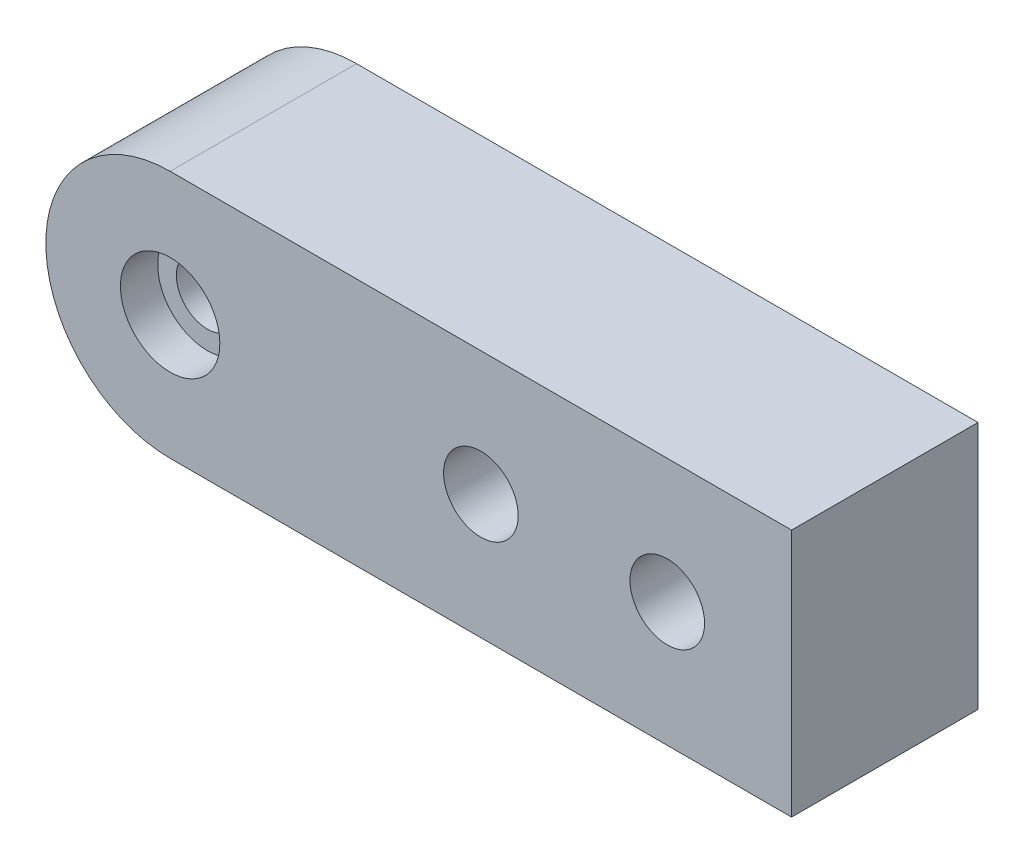
ISO-10303-21;
HEADER;
FILE_DESCRIPTION(('STEP AP214'),'2;1');
FILE_NAME('part.step','',(''),(''),'','','');
FILE_SCHEMA(('AUTOMOTIVE_DESIGN { 1 0 10303 214 1 1 1 1 }'));
ENDSEC;
DATA;
#1=APPLICATION_CONTEXT('core data for automotive mechanical design processes');
#2=APPLICATION_PROTOCOL_DEFINITION('international standard','automotive_design',2000,#1);
#3=PRODUCT_CONTEXT('',#1,'mechanical');
#4=PRODUCT('Part','Part','',(#3));
#5=PRODUCT_RELATED_PRODUCT_CATEGORY('part','',(#4));
#6=PRODUCT_DEFINITION_FORMATION('','',#4);
#7=PRODUCT_DEFINITION_CONTEXT('part definition',#1,'design');
#8=PRODUCT_DEFINITION('design','',#6,#7);
#9=PRODUCT_DEFINITION_SHAPE('','',#8);
#10=(LENGTH_UNIT() NAMED_UNIT(*) SI_UNIT(.MILLI.,.METRE.));
#11=(NAMED_UNIT(*) PLANE_ANGLE_UNIT() SI_UNIT($,.RADIAN.));
#12=(NAMED_UNIT(*) SI_UNIT($,.STERADIAN.) SOLID_ANGLE_UNIT());
#13=UNCERTAINTY_MEASURE_WITH_UNIT(LENGTH_MEASURE(1.E-05),#10,'distance_accuracy_value','');
#14=(GEOMETRIC_REPRESENTATION_CONTEXT(3) GLOBAL_UNCERTAINTY_ASSIGNED_CONTEXT((#13)) GLOBAL_UNIT_ASSIGNED_CONTEXT((#10,
#11,#12)) REPRESENTATION_CONTEXT('',''));
#15=CARTESIAN_POINT('',(0.,0.,0.));
#16=DIRECTION('',(0.,0.,1.));
#17=DIRECTION('',(1.,0.,0.));
#18=AXIS2_PLACEMENT_3D('',#15,#16,#17);
#19=CARTESIAN_POINT('',(-25.,-10.,15.));
#20=DIRECTION('',(0.,0.,-1.));
#21=DIRECTION('',(-1.,0.,0.));
#22=AXIS2_PLACEMENT_3D('',#19,#20,#21);
#23=CYLINDRICAL_SURFACE('',#22,3.);
#24=CARTESIAN_POINT('',(-25.,-10.,15.));
#25=DIRECTION('',(0.,0.,1.));
#26=DIRECTION('',(1.,0.,0.));
#27=AXIS2_PLACEMENT_3D('',#24,#25,#26);
#28=CIRCLE('',#27,3.);
#29=CARTESIAN_POINT('',(-22.,-10.,15.));
#30=VERTEX_POINT('',#29);
#31=EDGE_CURVE('E112',#30,#30,#28,.T.);
#32=ORIENTED_EDGE('',*,*,#31,.T.);
#33=EDGE_LOOP('',(#32));
#34=FACE_BOUND('',#33,.T.);
#35=CARTESIAN_POINT('',(-25.,-10.,6.));
#36=DIRECTION('',(0.,0.,-1.));
#37=DIRECTION('',(-1.,0.,0.));
#38=AXIS2_PLACEMENT_3D('',#35,#36,#37);
#39=CIRCLE('',#38,3.);
#40=CARTESIAN_POINT('',(-28.,-10.,6.));
#41=VERTEX_POINT('',#40);
#42=EDGE_CURVE('E45',#41,#41,#39,.T.);
#43=ORIENTED_EDGE('',*,*,#42,.T.);
#44=EDGE_LOOP('',(#43));
#45=FACE_BOUND('',#44,.T.);
#46=ADVANCED_FACE('F41',(#34,#45),#23,.F.);
#47=CARTESIAN_POINT('',(-10.,-10.,15.));
#48=DIRECTION('',(0.,0.,-1.));
#49=DIRECTION('',(-1.,0.,0.));
#50=AXIS2_PLACEMENT_3D('',#47,#48,#49);
#51=CYLINDRICAL_SURFACE('',#50,3.00000000000001);
#52=CARTESIAN_POINT('',(-10.,-10.,15.));
#53=DIRECTION('',(0.,0.,1.));
#54=DIRECTION('',(1.,0.,0.));
#55=AXIS2_PLACEMENT_3D('',#52,#53,#54);
#56=CIRCLE('',#55,3.00000000000001);
#57=CARTESIAN_POINT('',(-6.99999999999999,-10.,15.));
#58=VERTEX_POINT('',#57);
#59=EDGE_CURVE('E147',#58,#58,#56,.T.);
#60=ORIENTED_EDGE('',*,*,#59,.T.);
#61=EDGE_LOOP('',(#60));
#62=FACE_BOUND('',#61,.T.);
#63=CARTESIAN_POINT('',(-10.,-10.,6.));
#64=DIRECTION('',(0.,0.,-1.));
#65=DIRECTION('',(-1.,0.,0.));
#66=AXIS2_PLACEMENT_3D('',#63,#64,#65);
#67=CIRCLE('',#66,3.00000000000001);
#68=CARTESIAN_POINT('',(-13.,-10.,6.));
#69=VERTEX_POINT('',#68);
#70=EDGE_CURVE('E122',#69,#69,#67,.T.);
#71=ORIENTED_EDGE('',*,*,#70,.T.);
#72=EDGE_LOOP('',(#71));
#73=FACE_BOUND('',#72,.T.);
#74=ADVANCED_FACE('F159',(#62,#73),#51,.F.);
#75=CARTESIAN_POINT('',(-50.,-10.,15.));
#76=DIRECTION('',(0.,0.,1.));
#77=DIRECTION('',(1.,0.,0.));
#78=AXIS2_PLACEMENT_3D('',#75,#76,#77);
#79=PLANE('',#78);
#80=CARTESIAN_POINT('',(-50.,-10.,15.));
#81=DIRECTION('',(0.,0.,1.));
#82=DIRECTION('',(1.,0.,0.));
#83=AXIS2_PLACEMENT_3D('',#80,#81,#82);
#84=CIRCLE('',#83,4.00000000000001);
#85=CARTESIAN_POINT('',(-46.,-10.,15.));
#86=VERTEX_POINT('',#85);
#87=EDGE_CURVE('E120',#86,#86,#84,.T.);
#88=ORIENTED_EDGE('',*,*,#87,.F.);
#89=EDGE_LOOP('',(#88));
#90=FACE_BOUND('',#89,.T.);
#91=ORIENTED_EDGE('',*,*,#31,.F.);
#92=EDGE_LOOP('',(#91));
#93=FACE_BOUND('',#92,.T.);
#94=CARTESIAN_POINT('',(-50.,-10.,15.));
#95=DIRECTION('',(0.,0.,1.));
#96=DIRECTION('',(1.,0.,0.));
#97=AXIS2_PLACEMENT_3D('',#94,#95,#96);
#98=CIRCLE('',#97,10.);
#99=CARTESIAN_POINT('',(-50.,0.,15.));
#100=VERTEX_POINT('',#99);
#101=CARTESIAN_POINT('',(-50.,-20.,15.));
#102=VERTEX_POINT('',#101);
#103=EDGE_CURVE('E96',#100,#102,#98,.T.);
#104=ORIENTED_EDGE('',*,*,#103,.T.);
#105=DIRECTION('',(1.,0.,0.));
#106=VECTOR('',#105,1.);
#107=CARTESIAN_POINT('',(0.,-20.,15.));
#108=LINE('',#107,#106);
#109=CARTESIAN_POINT('',(0.,-20.,15.));
#110=VERTEX_POINT('',#109);
#111=EDGE_CURVE('E90',#102,#110,#108,.T.);
#112=ORIENTED_EDGE('',*,*,#111,.T.);
#113=DIRECTION('',(0.,1.,0.));
#114=VECTOR('',#113,1.);
#115=CARTESIAN_POINT('',(0.,0.,15.));
#116=LINE('',#115,#114);
#117=CARTESIAN_POINT('',(0.,0.,15.));
#118=VERTEX_POINT('',#117);
#119=EDGE_CURVE('E94',#110,#118,#116,.T.);
#120=ORIENTED_EDGE('',*,*,#119,.T.);
#121=DIRECTION('',(-1.,0.,0.));
#122=VECTOR('',#121,1.);
#123=CARTESIAN_POINT('',(-50.,0.,15.));
#124=LINE('',#123,#122);
#125=EDGE_CURVE('E60',#118,#100,#124,.T.);
#126=ORIENTED_EDGE('',*,*,#125,.T.);
#127=EDGE_LOOP('',(#104,#112,#120,#126));
#128=FACE_BOUND('',#127,.T.);
#129=ORIENTED_EDGE('',*,*,#59,.F.);
#130=EDGE_LOOP('',(#129));
#131=FACE_BOUND('',#130,.T.);
#132=ADVANCED_FACE('F91',(#90,#93,#128,#131),#79,.T.);
#133=CARTESIAN_POINT('',(-50.,-10.,0.));
#134=DIRECTION('',(0.,0.,1.));
#135=DIRECTION('',(1.,0.,0.));
#136=AXIS2_PLACEMENT_3D('',#133,#134,#135);
#137=PLANE('',#136);
#138=CARTESIAN_POINT('',(-10.,-10.,0.));
#139=DIRECTION('',(0.,0.,-1.));
#140=DIRECTION('',(-1.,0.,0.));
#141=AXIS2_PLACEMENT_3D('',#138,#139,#140);
#142=CIRCLE('',#141,5.);
#143=CARTESIAN_POINT('',(-15.,-10.,0.));
#144=VERTEX_POINT('',#143);
#145=EDGE_CURVE('E129',#144,#144,#142,.T.);
#146=ORIENTED_EDGE('',*,*,#145,.F.);
#147=EDGE_LOOP('',(#146));
#148=FACE_BOUND('',#147,.T.);
#149=CARTESIAN_POINT('',(-25.,-10.,0.));
#150=DIRECTION('',(0.,0.,-1.));
#151=DIRECTION('',(-1.,0.,0.));
#152=AXIS2_PLACEMENT_3D('',#149,#150,#151);
#153=CIRCLE('',#152,5.);
#154=CARTESIAN_POINT('',(-30.,-10.,0.));
#155=VERTEX_POINT('',#154);
#156=EDGE_CURVE('E134',#155,#155,#153,.T.);
#157=ORIENTED_EDGE('',*,*,#156,.F.);
#158=EDGE_LOOP('',(#157));
#159=FACE_BOUND('',#158,.T.);
#160=CARTESIAN_POINT('',(-50.,-10.,0.));
#161=DIRECTION('',(0.,0.,1.));
#162=DIRECTION('',(1.,0.,0.));
#163=AXIS2_PLACEMENT_3D('',#160,#161,#162);
#164=CIRCLE('',#163,2.5);
#165=CARTESIAN_POINT('',(-47.5,-10.,0.));
#166=VERTEX_POINT('',#165);
#167=EDGE_CURVE('E118',#166,#166,#164,.T.);
#168=ORIENTED_EDGE('',*,*,#167,.T.);
#169=EDGE_LOOP('',(#168));
#170=FACE_BOUND('',#169,.T.);
#171=CARTESIAN_POINT('',(-50.,-10.,0.));
#172=DIRECTION('',(0.,0.,1.));
#173=DIRECTION('',(1.,0.,0.));
#174=AXIS2_PLACEMENT_3D('',#171,#172,#173);
#175=CIRCLE('',#174,10.);
#176=CARTESIAN_POINT('',(-50.,0.,0.));
#177=VERTEX_POINT('',#176);
#178=CARTESIAN_POINT('',(-50.,-20.,0.));
#179=VERTEX_POINT('',#178);
#180=EDGE_CURVE('E109',#177,#179,#175,.T.);
#181=ORIENTED_EDGE('',*,*,#180,.F.);
#182=DIRECTION('',(-1.,0.,0.));
#183=VECTOR('',#182,1.);
#184=CARTESIAN_POINT('',(-50.,0.,0.));
#185=LINE('',#184,#183);
#186=CARTESIAN_POINT('',(0.,0.,0.));
#187=VERTEX_POINT('',#186);
#188=EDGE_CURVE('E83',#187,#177,#185,.T.);
#189=ORIENTED_EDGE('',*,*,#188,.F.);
#190=DIRECTION('',(0.,1.,0.));
#191=VECTOR('',#190,1.);
#192=CARTESIAN_POINT('',(0.,0.,0.));
#193=LINE('',#192,#191);
#194=CARTESIAN_POINT('',(0.,-20.,0.));
#195=VERTEX_POINT('',#194);
#196=EDGE_CURVE('E77',#195,#187,#193,.T.);
#197=ORIENTED_EDGE('',*,*,#196,.F.);
#198=DIRECTION('',(1.,0.,0.));
#199=VECTOR('',#198,1.);
#200=CARTESIAN_POINT('',(0.,-20.,0.));
#201=LINE('',#200,#199);
#202=EDGE_CURVE('E100',#179,#195,#201,.T.);
#203=ORIENTED_EDGE('',*,*,#202,.F.);
#204=EDGE_LOOP('',(#181,#189,#197,#203));
#205=FACE_BOUND('',#204,.T.);
#206=ADVANCED_FACE('F158',(#148,#159,#170,#205),#137,.F.);
#207=CARTESIAN_POINT('',(-50.,-10.,15.));
#208=DIRECTION('',(0.,0.,-1.));
#209=DIRECTION('',(-1.,0.,0.));
#210=AXIS2_PLACEMENT_3D('',#207,#208,#209);
#211=CYLINDRICAL_SURFACE('',#210,10.);
#212=ORIENTED_EDGE('',*,*,#180,.T.);
#213=DIRECTION('',(0.,0.,-1.));
#214=VECTOR('',#213,1.);
#215=CARTESIAN_POINT('',(-50.,-20.,15.));
#216=LINE('',#215,#214);
#217=EDGE_CURVE('E11',#102,#179,#216,.T.);
#218=ORIENTED_EDGE('',*,*,#217,.F.);
#219=ORIENTED_EDGE('',*,*,#103,.F.);
#220=DIRECTION('',(0.,0.,-1.));
#221=VECTOR('',#220,1.);
#222=CARTESIAN_POINT('',(-50.,0.,15.));
#223=LINE('',#222,#221);
#224=EDGE_CURVE('E105',#100,#177,#223,.T.);
#225=ORIENTED_EDGE('',*,*,#224,.T.);
#226=EDGE_LOOP('',(#212,#218,#219,#225));
#227=FACE_BOUND('',#226,.T.);
#228=ADVANCED_FACE('F43',(#227),#211,.T.);
#229=CARTESIAN_POINT('',(0.,-20.,15.));
#230=DIRECTION('',(0.,1.,0.));
#231=DIRECTION('',(-1.,0.,0.));
#232=AXIS2_PLACEMENT_3D('',#229,#230,#231);
#233=PLANE('',#232);
#234=ORIENTED_EDGE('',*,*,#202,.T.);
#235=DIRECTION('',(0.,0.,-1.));
#236=VECTOR('',#235,1.);
#237=CARTESIAN_POINT('',(0.,-20.,15.));
#238=LINE('',#237,#236);
#239=EDGE_CURVE('E51',#110,#195,#238,.T.);
#240=ORIENTED_EDGE('',*,*,#239,.F.);
#241=ORIENTED_EDGE('',*,*,#111,.F.);
#242=ORIENTED_EDGE('',*,*,#217,.T.);
#243=EDGE_LOOP('',(#234,#240,#241,#242));
#244=FACE_BOUND('',#243,.T.);
#245=ADVANCED_FACE('F99',(#244),#233,.F.);
#246=CARTESIAN_POINT('',(0.,0.,15.));
#247=DIRECTION('',(-1.,0.,0.));
#248=DIRECTION('',(0.,0.,1.));
#249=AXIS2_PLACEMENT_3D('',#246,#247,#248);
#250=PLANE('',#249);
#251=ORIENTED_EDGE('',*,*,#196,.T.);
#252=DIRECTION('',(0.,0.,-1.));
#253=VECTOR('',#252,1.);
#254=CARTESIAN_POINT('',(0.,0.,15.));
#255=LINE('',#254,#253);
#256=EDGE_CURVE('E101',#118,#187,#255,.T.);
#257=ORIENTED_EDGE('',*,*,#256,.F.);
#258=ORIENTED_EDGE('',*,*,#119,.F.);
#259=ORIENTED_EDGE('',*,*,#239,.T.);
#260=EDGE_LOOP('',(#251,#257,#258,#259));
#261=FACE_BOUND('',#260,.T.);
#262=ADVANCED_FACE('F103',(#261),#250,.F.);
#263=CARTESIAN_POINT('',(-50.,0.,15.));
#264=DIRECTION('',(0.,-1.,0.));
#265=DIRECTION('',(0.,0.,-1.));
#266=AXIS2_PLACEMENT_3D('',#263,#264,#265);
#267=PLANE('',#266);
#268=ORIENTED_EDGE('',*,*,#188,.T.);
#269=ORIENTED_EDGE('',*,*,#224,.F.);
#270=ORIENTED_EDGE('',*,*,#125,.F.);
#271=ORIENTED_EDGE('',*,*,#256,.T.);
#272=EDGE_LOOP('',(#268,#269,#270,#271));
#273=FACE_BOUND('',#272,.T.);
#274=ADVANCED_FACE('F182',(#273),#267,.F.);
#275=CARTESIAN_POINT('',(-50.,-10.,12.));
#276=DIRECTION('',(0.,0.,1.));
#277=DIRECTION('',(1.,0.,0.));
#278=AXIS2_PLACEMENT_3D('',#275,#276,#277);
#279=CYLINDRICAL_SURFACE('',#278,4.00000000000001);
#280=CARTESIAN_POINT('',(-50.,-10.,12.));
#281=DIRECTION('',(0.,0.,1.));
#282=DIRECTION('',(1.,0.,0.));
#283=AXIS2_PLACEMENT_3D('',#280,#281,#282);
#284=CIRCLE('',#283,4.00000000000001);
#285=CARTESIAN_POINT('',(-46.,-10.,12.));
#286=VERTEX_POINT('',#285);
#287=EDGE_CURVE('E144',#286,#286,#284,.T.);
#288=ORIENTED_EDGE('',*,*,#287,.F.);
#289=EDGE_LOOP('',(#288));
#290=FACE_BOUND('',#289,.T.);
#291=ORIENTED_EDGE('',*,*,#87,.T.);
#292=EDGE_LOOP('',(#291));
#293=FACE_BOUND('',#292,.T.);
#294=ADVANCED_FACE('F179',(#290,#293),#279,.F.);
#295=CARTESIAN_POINT('',(-50.,-10.,12.));
#296=DIRECTION('',(0.,0.,1.));
#297=DIRECTION('',(1.,0.,0.));
#298=AXIS2_PLACEMENT_3D('',#295,#296,#297);
#299=PLANE('',#298);
#300=CARTESIAN_POINT('',(-50.,-10.,12.));
#301=DIRECTION('',(0.,0.,1.));
#302=DIRECTION('',(1.,0.,0.));
#303=AXIS2_PLACEMENT_3D('',#300,#301,#302);
#304=CIRCLE('',#303,2.5);
#305=CARTESIAN_POINT('',(-47.5,-10.,12.));
#306=VERTEX_POINT('',#305);
#307=EDGE_CURVE('E121',#306,#306,#304,.T.);
#308=ORIENTED_EDGE('',*,*,#307,.F.);
#309=EDGE_LOOP('',(#308));
#310=FACE_BOUND('',#309,.T.);
#311=ORIENTED_EDGE('',*,*,#287,.T.);
#312=EDGE_LOOP('',(#311));
#313=FACE_BOUND('',#312,.T.);
#314=ADVANCED_FACE('F181',(#310,#313),#299,.T.);
#315=CARTESIAN_POINT('',(-50.,-10.,-3.));
#316=DIRECTION('',(0.,0.,1.));
#317=DIRECTION('',(1.,0.,0.));
#318=AXIS2_PLACEMENT_3D('',#315,#316,#317);
#319=CYLINDRICAL_SURFACE('',#318,2.5);
#320=ORIENTED_EDGE('',*,*,#307,.T.);
#321=EDGE_LOOP('',(#320));
#322=FACE_BOUND('',#321,.T.);
#323=ORIENTED_EDGE('',*,*,#167,.F.);
#324=EDGE_LOOP('',(#323));
#325=FACE_BOUND('',#324,.T.);
#326=ADVANCED_FACE('F186',(#322,#325),#319,.F.);
#327=CARTESIAN_POINT('',(-10.,-10.,6.));
#328=DIRECTION('',(0.,0.,-1.));
#329=DIRECTION('',(-1.,0.,0.));
#330=AXIS2_PLACEMENT_3D('',#327,#328,#329);
#331=CYLINDRICAL_SURFACE('',#330,5.);
#332=CARTESIAN_POINT('',(-10.,-10.,6.));
#333=DIRECTION('',(0.,0.,-1.));
#334=DIRECTION('',(-1.,0.,0.));
#335=AXIS2_PLACEMENT_3D('',#332,#333,#334);
#336=CIRCLE('',#335,5.);
#337=CARTESIAN_POINT('',(-15.,-10.,6.));
#338=VERTEX_POINT('',#337);
#339=EDGE_CURVE('E124',#338,#338,#336,.T.);
#340=ORIENTED_EDGE('',*,*,#339,.F.);
#341=EDGE_LOOP('',(#340));
#342=FACE_BOUND('',#341,.T.);
#343=ORIENTED_EDGE('',*,*,#145,.T.);
#344=EDGE_LOOP('',(#343));
#345=FACE_BOUND('',#344,.T.);
#346=ADVANCED_FACE('F189',(#342,#345),#331,.F.);
#347=CARTESIAN_POINT('',(-10.,-10.,6.));
#348=DIRECTION('',(0.,0.,-1.));
#349=DIRECTION('',(-1.,0.,0.));
#350=AXIS2_PLACEMENT_3D('',#347,#348,#349);
#351=PLANE('',#350);
#352=ORIENTED_EDGE('',*,*,#70,.F.);
#353=EDGE_LOOP('',(#352));
#354=FACE_BOUND('',#353,.T.);
#355=ORIENTED_EDGE('',*,*,#339,.T.);
#356=EDGE_LOOP('',(#355));
#357=FACE_BOUND('',#356,.T.);
#358=ADVANCED_FACE('F198',(#354,#357),#351,.T.);
#359=CARTESIAN_POINT('',(-25.,-10.,6.));
#360=DIRECTION('',(0.,0.,-1.));
#361=DIRECTION('',(-1.,0.,0.));
#362=AXIS2_PLACEMENT_3D('',#359,#360,#361);
#363=CYLINDRICAL_SURFACE('',#362,5.);
#364=CARTESIAN_POINT('',(-25.,-10.,6.));
#365=DIRECTION('',(0.,0.,-1.));
#366=DIRECTION('',(-1.,0.,0.));
#367=AXIS2_PLACEMENT_3D('',#364,#365,#366);
#368=CIRCLE('',#367,5.);
#369=CARTESIAN_POINT('',(-30.,-10.,6.));
#370=VERTEX_POINT('',#369);
#371=EDGE_CURVE('E139',#370,#370,#368,.T.);
#372=ORIENTED_EDGE('',*,*,#371,.F.);
#373=EDGE_LOOP('',(#372));
#374=FACE_BOUND('',#373,.T.);
#375=ORIENTED_EDGE('',*,*,#156,.T.);
#376=EDGE_LOOP('',(#375));
#377=FACE_BOUND('',#376,.T.);
#378=ADVANCED_FACE('F194',(#374,#377),#363,.F.);
#379=CARTESIAN_POINT('',(-25.,-10.,6.));
#380=DIRECTION('',(0.,0.,-1.));
#381=DIRECTION('',(-1.,0.,0.));
#382=AXIS2_PLACEMENT_3D('',#379,#380,#381);
#383=PLANE('',#382);
#384=ORIENTED_EDGE('',*,*,#42,.F.);
#385=EDGE_LOOP('',(#384));
#386=FACE_BOUND('',#385,.T.);
#387=ORIENTED_EDGE('',*,*,#371,.T.);
#388=EDGE_LOOP('',(#387));
#389=FACE_BOUND('',#388,.T.);
#390=ADVANCED_FACE('F191',(#386,#389),#383,.T.);
#391=CLOSED_SHELL('',(#46,#74,#132,#206,#228,#245,#262,#274,#294,#314,#326,#346,#358,#378,#390));
#392=MANIFOLD_SOLID_BREP('B2',#391);
#393=ADVANCED_BREP_SHAPE_REPRESENTATION('',(#18,#392),#14);
#394=SHAPE_DEFINITION_REPRESENTATION(#9,#393);
ENDSEC;
END-ISO-10303-21;
